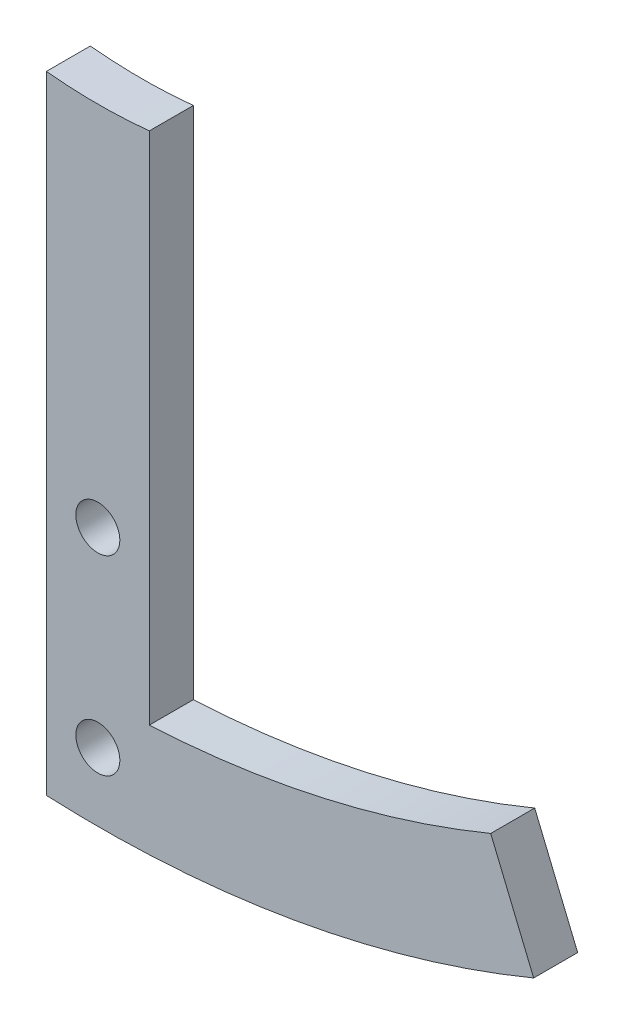
ISO-10303-21;
HEADER;
FILE_DESCRIPTION(('STEP AP214'),'2;1');
FILE_NAME('part.step','',(''),(''),'','','');
FILE_SCHEMA(('AUTOMOTIVE_DESIGN { 1 0 10303 214 1 1 1 1 }'));
ENDSEC;
DATA;
#1=APPLICATION_CONTEXT('core data for automotive mechanical design processes');
#2=APPLICATION_PROTOCOL_DEFINITION('international standard','automotive_design',2000,#1);
#3=PRODUCT_CONTEXT('',#1,'mechanical');
#4=PRODUCT('Part','Part','',(#3));
#5=PRODUCT_RELATED_PRODUCT_CATEGORY('part','',(#4));
#6=PRODUCT_DEFINITION_FORMATION('','',#4);
#7=PRODUCT_DEFINITION_CONTEXT('part definition',#1,'design');
#8=PRODUCT_DEFINITION('design','',#6,#7);
#9=PRODUCT_DEFINITION_SHAPE('','',#8);
#10=(LENGTH_UNIT() NAMED_UNIT(*) SI_UNIT(.MILLI.,.METRE.));
#11=(NAMED_UNIT(*) PLANE_ANGLE_UNIT() SI_UNIT($,.RADIAN.));
#12=(NAMED_UNIT(*) SI_UNIT($,.STERADIAN.) SOLID_ANGLE_UNIT());
#13=UNCERTAINTY_MEASURE_WITH_UNIT(LENGTH_MEASURE(1.E-05),#10,'distance_accuracy_value','');
#14=(GEOMETRIC_REPRESENTATION_CONTEXT(3) GLOBAL_UNCERTAINTY_ASSIGNED_CONTEXT((#13)) GLOBAL_UNIT_ASSIGNED_CONTEXT((#10,
#11,#12)) REPRESENTATION_CONTEXT('',''));
#15=CARTESIAN_POINT('',(0.,0.,0.));
#16=DIRECTION('',(0.,0.,1.));
#17=DIRECTION('',(1.,0.,0.));
#18=AXIS2_PLACEMENT_3D('',#15,#16,#17);
#19=CARTESIAN_POINT('',(0.,0.,3.));
#20=DIRECTION('',(0.,0.,1.));
#21=DIRECTION('',(1.,0.,0.));
#22=AXIS2_PLACEMENT_3D('',#19,#20,#21);
#23=PLANE('',#22);
#24=CARTESIAN_POINT('',(0.,0.,3.));
#25=DIRECTION('',(0.,0.,1.));
#26=DIRECTION('',(1.,0.,0.));
#27=AXIS2_PLACEMENT_3D('',#24,#25,#26);
#28=CIRCLE('',#27,35.);
#29=CARTESIAN_POINT('',(-3.51162579629019,-34.8233899020016,3.));
#30=VERTEX_POINT('',#29);
#31=CARTESIAN_POINT('',(3.51162579629044,-34.8233899020016,3.));
#32=VERTEX_POINT('',#31);
#33=EDGE_CURVE('E54',#30,#32,#28,.T.);
#34=ORIENTED_EDGE('',*,*,#33,.F.);
#35=DIRECTION('',(0.,1.,0.));
#36=VECTOR('',#35,1.);
#37=CARTESIAN_POINT('',(-3.51162579629031,0.,3.));
#38=LINE('',#37,#36);
#39=CARTESIAN_POINT('',(-3.51162579629027,-77.5746941612059,3.));
#40=VERTEX_POINT('',#39);
#41=EDGE_CURVE('E109',#40,#30,#38,.T.);
#42=ORIENTED_EDGE('',*,*,#41,.F.);
#43=CARTESIAN_POINT('',(0.,0.,3.));
#44=DIRECTION('',(0.,0.,-1.));
#45=DIRECTION('',(-1.,0.,0.));
#46=AXIS2_PLACEMENT_3D('',#43,#44,#45);
#47=CIRCLE('',#46,77.6541350472581);
#48=CARTESIAN_POINT('',(29.7169509372278,-71.7430659850288,3.));
#49=VERTEX_POINT('',#48);
#50=EDGE_CURVE('E117',#49,#40,#47,.T.);
#51=ORIENTED_EDGE('',*,*,#50,.F.);
#52=DIRECTION('',(0.382683432365101,-0.923879532511282,0.));
#53=VECTOR('',#52,1.);
#54=CARTESIAN_POINT('',(0.,0.,3.));
#55=LINE('',#54,#53);
#56=CARTESIAN_POINT('',(26.787840265557,-64.6715672757898,3.));
#57=VERTEX_POINT('',#56);
#58=EDGE_CURVE('E123',#57,#49,#55,.T.);
#59=ORIENTED_EDGE('',*,*,#58,.F.);
#60=CARTESIAN_POINT('',(0.,0.,3.));
#61=DIRECTION('',(0.,0.,-1.));
#62=DIRECTION('',(-1.,0.,0.));
#63=AXIS2_PLACEMENT_3D('',#60,#61,#62);
#64=CIRCLE('',#63,70.);
#65=CARTESIAN_POINT('',(3.51162579629037,-69.9118622571794,3.));
#66=VERTEX_POINT('',#65);
#67=EDGE_CURVE('E88',#57,#66,#64,.T.);
#68=ORIENTED_EDGE('',*,*,#67,.T.);
#69=DIRECTION('',(0.,1.,0.));
#70=VECTOR('',#69,1.);
#71=CARTESIAN_POINT('',(3.51162579629032,0.,3.));
#72=LINE('',#71,#70);
#73=EDGE_CURVE('E111',#66,#32,#72,.T.);
#74=ORIENTED_EDGE('',*,*,#73,.T.);
#75=EDGE_LOOP('',(#34,#42,#51,#59,#68,#74));
#76=FACE_BOUND('',#75,.T.);
#77=CARTESIAN_POINT('',(0.,-60.,3.));
#78=DIRECTION('',(0.,0.,1.));
#79=DIRECTION('',(1.,0.,0.));
#80=AXIS2_PLACEMENT_3D('',#77,#78,#79);
#81=CIRCLE('',#80,1.5);
#82=CARTESIAN_POINT('',(1.5,-60.,3.));
#83=VERTEX_POINT('',#82);
#84=EDGE_CURVE('E178',#83,#83,#81,.T.);
#85=ORIENTED_EDGE('',*,*,#84,.F.);
#86=EDGE_LOOP('',(#85));
#87=FACE_BOUND('',#86,.T.);
#88=CARTESIAN_POINT('',(0.,-73.,3.));
#89=DIRECTION('',(0.,0.,1.));
#90=DIRECTION('',(1.,0.,0.));
#91=AXIS2_PLACEMENT_3D('',#88,#89,#90);
#92=CIRCLE('',#91,1.5);
#93=CARTESIAN_POINT('',(1.5,-73.,3.));
#94=VERTEX_POINT('',#93);
#95=EDGE_CURVE('E104',#94,#94,#92,.T.);
#96=ORIENTED_EDGE('',*,*,#95,.F.);
#97=EDGE_LOOP('',(#96));
#98=FACE_BOUND('',#97,.T.);
#99=ADVANCED_FACE('F38',(#76,#87,#98),#23,.T.);
#100=CARTESIAN_POINT('',(0.,0.,0.));
#101=DIRECTION('',(0.,0.,1.));
#102=DIRECTION('',(1.,0.,0.));
#103=AXIS2_PLACEMENT_3D('',#100,#101,#102);
#104=PLANE('',#103);
#105=CARTESIAN_POINT('',(0.,-60.,0.));
#106=DIRECTION('',(0.,0.,1.));
#107=DIRECTION('',(1.,0.,0.));
#108=AXIS2_PLACEMENT_3D('',#105,#106,#107);
#109=CIRCLE('',#108,1.5);
#110=CARTESIAN_POINT('',(1.5,-60.,0.));
#111=VERTEX_POINT('',#110);
#112=EDGE_CURVE('E132',#111,#111,#109,.T.);
#113=ORIENTED_EDGE('',*,*,#112,.T.);
#114=EDGE_LOOP('',(#113));
#115=FACE_BOUND('',#114,.T.);
#116=CARTESIAN_POINT('',(0.,-73.,0.));
#117=DIRECTION('',(0.,0.,1.));
#118=DIRECTION('',(1.,0.,0.));
#119=AXIS2_PLACEMENT_3D('',#116,#117,#118);
#120=CIRCLE('',#119,1.5);
#121=CARTESIAN_POINT('',(1.5,-73.,0.));
#122=VERTEX_POINT('',#121);
#123=EDGE_CURVE('E174',#122,#122,#120,.T.);
#124=ORIENTED_EDGE('',*,*,#123,.T.);
#125=EDGE_LOOP('',(#124));
#126=FACE_BOUND('',#125,.T.);
#127=DIRECTION('',(0.,1.,0.));
#128=VECTOR('',#127,1.);
#129=CARTESIAN_POINT('',(-3.51162579629031,0.,0.));
#130=LINE('',#129,#128);
#131=CARTESIAN_POINT('',(-3.51162579629027,-77.5746941612059,0.));
#132=VERTEX_POINT('',#131);
#133=CARTESIAN_POINT('',(-3.51162579629019,-34.8233899020016,0.));
#134=VERTEX_POINT('',#133);
#135=EDGE_CURVE('E142',#132,#134,#130,.T.);
#136=ORIENTED_EDGE('',*,*,#135,.T.);
#137=CARTESIAN_POINT('',(0.,0.,0.));
#138=DIRECTION('',(0.,0.,1.));
#139=DIRECTION('',(1.,0.,0.));
#140=AXIS2_PLACEMENT_3D('',#137,#138,#139);
#141=CIRCLE('',#140,35.);
#142=CARTESIAN_POINT('',(3.51162579629044,-34.8233899020016,0.));
#143=VERTEX_POINT('',#142);
#144=EDGE_CURVE('E101',#134,#143,#141,.T.);
#145=ORIENTED_EDGE('',*,*,#144,.T.);
#146=DIRECTION('',(0.,1.,0.));
#147=VECTOR('',#146,1.);
#148=CARTESIAN_POINT('',(3.51162579629032,0.,0.));
#149=LINE('',#148,#147);
#150=CARTESIAN_POINT('',(3.51162579629037,-69.9118622571794,0.));
#151=VERTEX_POINT('',#150);
#152=EDGE_CURVE('E127',#151,#143,#149,.T.);
#153=ORIENTED_EDGE('',*,*,#152,.F.);
#154=CARTESIAN_POINT('',(0.,0.,0.));
#155=DIRECTION('',(0.,0.,-1.));
#156=DIRECTION('',(-1.,0.,0.));
#157=AXIS2_PLACEMENT_3D('',#154,#155,#156);
#158=CIRCLE('',#157,70.);
#159=CARTESIAN_POINT('',(26.787840265557,-64.6715672757898,0.));
#160=VERTEX_POINT('',#159);
#161=EDGE_CURVE('E131',#160,#151,#158,.T.);
#162=ORIENTED_EDGE('',*,*,#161,.F.);
#163=DIRECTION('',(0.382683432365101,-0.923879532511282,0.));
#164=VECTOR('',#163,1.);
#165=CARTESIAN_POINT('',(0.,0.,0.));
#166=LINE('',#165,#164);
#167=CARTESIAN_POINT('',(29.7169509372278,-71.7430659850288,0.));
#168=VERTEX_POINT('',#167);
#169=EDGE_CURVE('E135',#160,#168,#166,.T.);
#170=ORIENTED_EDGE('',*,*,#169,.T.);
#171=CARTESIAN_POINT('',(0.,0.,0.));
#172=DIRECTION('',(0.,0.,-1.));
#173=DIRECTION('',(-1.,0.,0.));
#174=AXIS2_PLACEMENT_3D('',#171,#172,#173);
#175=CIRCLE('',#174,77.6541350472581);
#176=EDGE_CURVE('E139',#168,#132,#175,.T.);
#177=ORIENTED_EDGE('',*,*,#176,.T.);
#178=EDGE_LOOP('',(#136,#145,#153,#162,#170,#177));
#179=FACE_BOUND('',#178,.T.);
#180=ADVANCED_FACE('F40',(#115,#126,#179),#104,.F.);
#181=CARTESIAN_POINT('',(-3.51162579629031,0.,3.));
#182=DIRECTION('',(-1.,0.,0.));
#183=DIRECTION('',(0.,-1.,0.));
#184=AXIS2_PLACEMENT_3D('',#181,#182,#183);
#185=PLANE('',#184);
#186=DIRECTION('',(0.,0.,1.));
#187=VECTOR('',#186,1.);
#188=CARTESIAN_POINT('',(-3.51162579629019,-34.8233899020016,0.));
#189=LINE('',#188,#187);
#190=EDGE_CURVE('E98',#134,#30,#189,.T.);
#191=ORIENTED_EDGE('',*,*,#190,.F.);
#192=ORIENTED_EDGE('',*,*,#135,.F.);
#193=DIRECTION('',(0.,0.,-1.));
#194=VECTOR('',#193,1.);
#195=CARTESIAN_POINT('',(-3.51162579629027,-77.5746941612059,3.));
#196=LINE('',#195,#194);
#197=EDGE_CURVE('E47',#40,#132,#196,.T.);
#198=ORIENTED_EDGE('',*,*,#197,.F.);
#199=ORIENTED_EDGE('',*,*,#41,.T.);
#200=EDGE_LOOP('',(#191,#192,#198,#199));
#201=FACE_BOUND('',#200,.T.);
#202=ADVANCED_FACE('F114',(#201),#185,.T.);
#203=CARTESIAN_POINT('',(3.51162579629032,0.,3.));
#204=DIRECTION('',(-1.,0.,0.));
#205=DIRECTION('',(0.,-1.,0.));
#206=AXIS2_PLACEMENT_3D('',#203,#204,#205);
#207=PLANE('',#206);
#208=ORIENTED_EDGE('',*,*,#152,.T.);
#209=DIRECTION('',(0.,0.,1.));
#210=VECTOR('',#209,1.);
#211=CARTESIAN_POINT('',(3.51162579629044,-34.8233899020016,0.));
#212=LINE('',#211,#210);
#213=EDGE_CURVE('E11',#143,#32,#212,.T.);
#214=ORIENTED_EDGE('',*,*,#213,.T.);
#215=ORIENTED_EDGE('',*,*,#73,.F.);
#216=DIRECTION('',(0.,0.,-1.));
#217=VECTOR('',#216,1.);
#218=CARTESIAN_POINT('',(3.51162579629037,-69.9118622571794,3.));
#219=LINE('',#218,#217);
#220=EDGE_CURVE('E116',#66,#151,#219,.T.);
#221=ORIENTED_EDGE('',*,*,#220,.T.);
#222=EDGE_LOOP('',(#208,#214,#215,#221));
#223=FACE_BOUND('',#222,.T.);
#224=ADVANCED_FACE('F164',(#223),#207,.F.);
#225=CARTESIAN_POINT('',(0.,0.,3.));
#226=DIRECTION('',(0.,0.,-1.));
#227=DIRECTION('',(-1.,0.,0.));
#228=AXIS2_PLACEMENT_3D('',#225,#226,#227);
#229=CYLINDRICAL_SURFACE('',#228,77.6541350472581);
#230=ORIENTED_EDGE('',*,*,#176,.F.);
#231=DIRECTION('',(0.,0.,-1.));
#232=VECTOR('',#231,1.);
#233=CARTESIAN_POINT('',(29.7169509372278,-71.7430659850288,3.));
#234=LINE('',#233,#232);
#235=EDGE_CURVE('E147',#49,#168,#234,.T.);
#236=ORIENTED_EDGE('',*,*,#235,.F.);
#237=ORIENTED_EDGE('',*,*,#50,.T.);
#238=ORIENTED_EDGE('',*,*,#197,.T.);
#239=EDGE_LOOP('',(#230,#236,#237,#238));
#240=FACE_BOUND('',#239,.T.);
#241=ADVANCED_FACE('F160',(#240),#229,.T.);
#242=CARTESIAN_POINT('',(0.,0.,3.));
#243=DIRECTION('',(0.923879532511282,0.382683432365101,0.));
#244=DIRECTION('',(-0.382683432365101,0.923879532511282,0.));
#245=AXIS2_PLACEMENT_3D('',#242,#243,#244);
#246=PLANE('',#245);
#247=ORIENTED_EDGE('',*,*,#169,.F.);
#248=DIRECTION('',(0.,0.,-1.));
#249=VECTOR('',#248,1.);
#250=CARTESIAN_POINT('',(26.787840265557,-64.6715672757898,3.));
#251=LINE('',#250,#249);
#252=EDGE_CURVE('E122',#57,#160,#251,.T.);
#253=ORIENTED_EDGE('',*,*,#252,.F.);
#254=ORIENTED_EDGE('',*,*,#58,.T.);
#255=ORIENTED_EDGE('',*,*,#235,.T.);
#256=EDGE_LOOP('',(#247,#253,#254,#255));
#257=FACE_BOUND('',#256,.T.);
#258=ADVANCED_FACE('F159',(#257),#246,.T.);
#259=CARTESIAN_POINT('',(0.,0.,3.));
#260=DIRECTION('',(0.,0.,-1.));
#261=DIRECTION('',(-1.,0.,0.));
#262=AXIS2_PLACEMENT_3D('',#259,#260,#261);
#263=CYLINDRICAL_SURFACE('',#262,70.);
#264=ORIENTED_EDGE('',*,*,#161,.T.);
#265=ORIENTED_EDGE('',*,*,#220,.F.);
#266=ORIENTED_EDGE('',*,*,#67,.F.);
#267=ORIENTED_EDGE('',*,*,#252,.T.);
#268=EDGE_LOOP('',(#264,#265,#266,#267));
#269=FACE_BOUND('',#268,.T.);
#270=ADVANCED_FACE('F153',(#269),#263,.F.);
#271=CARTESIAN_POINT('',(0.,-73.,0.));
#272=DIRECTION('',(0.,0.,1.));
#273=DIRECTION('',(1.,0.,0.));
#274=AXIS2_PLACEMENT_3D('',#271,#272,#273);
#275=CYLINDRICAL_SURFACE('',#274,1.5);
#276=ORIENTED_EDGE('',*,*,#123,.F.);
#277=EDGE_LOOP('',(#276));
#278=FACE_BOUND('',#277,.T.);
#279=ORIENTED_EDGE('',*,*,#95,.T.);
#280=EDGE_LOOP('',(#279));
#281=FACE_BOUND('',#280,.T.);
#282=ADVANCED_FACE('F191',(#278,#281),#275,.F.);
#283=CARTESIAN_POINT('',(0.,-60.,0.));
#284=DIRECTION('',(0.,0.,1.));
#285=DIRECTION('',(1.,0.,0.));
#286=AXIS2_PLACEMENT_3D('',#283,#284,#285);
#287=CYLINDRICAL_SURFACE('',#286,1.5);
#288=ORIENTED_EDGE('',*,*,#112,.F.);
#289=EDGE_LOOP('',(#288));
#290=FACE_BOUND('',#289,.T.);
#291=ORIENTED_EDGE('',*,*,#84,.T.);
#292=EDGE_LOOP('',(#291));
#293=FACE_BOUND('',#292,.T.);
#294=ADVANCED_FACE('F188',(#290,#293),#287,.F.);
#295=CARTESIAN_POINT('',(0.,0.,0.));
#296=DIRECTION('',(0.,0.,1.));
#297=DIRECTION('',(1.,0.,0.));
#298=AXIS2_PLACEMENT_3D('',#295,#296,#297);
#299=CYLINDRICAL_SURFACE('',#298,35.);
#300=ORIENTED_EDGE('',*,*,#190,.T.);
#301=ORIENTED_EDGE('',*,*,#33,.T.);
#302=ORIENTED_EDGE('',*,*,#213,.F.);
#303=ORIENTED_EDGE('',*,*,#144,.F.);
#304=EDGE_LOOP('',(#300,#301,#302,#303));
#305=FACE_BOUND('',#304,.T.);
#306=ADVANCED_FACE('F99',(#305),#299,.F.);
#307=CLOSED_SHELL('',(#99,#180,#202,#224,#241,#258,#270,#282,#294,#306));
#308=MANIFOLD_SOLID_BREP('B2',#307);
#309=ADVANCED_BREP_SHAPE_REPRESENTATION('',(#18,#308),#14);
#310=SHAPE_DEFINITION_REPRESENTATION(#9,#309);
ENDSEC;
END-ISO-10303-21;
